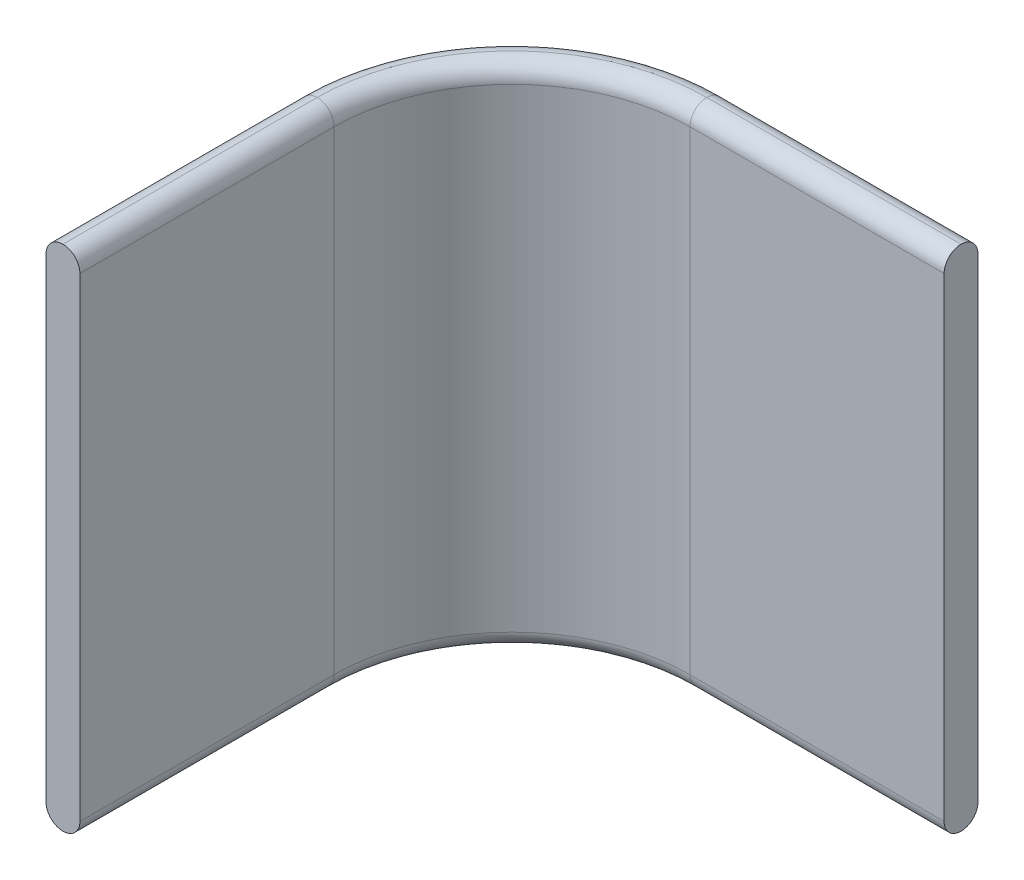
ISO-10303-21;
HEADER;
FILE_DESCRIPTION(('STEP AP214'),'2;1');
FILE_NAME('part.step','',(''),(''),'','','');
FILE_SCHEMA(('AUTOMOTIVE_DESIGN { 1 0 10303 214 1 1 1 1 }'));
ENDSEC;
DATA;
#1=APPLICATION_CONTEXT('core data for automotive mechanical design processes');
#2=APPLICATION_PROTOCOL_DEFINITION('international standard','automotive_design',2000,#1);
#3=PRODUCT_CONTEXT('',#1,'mechanical');
#4=PRODUCT('Part','Part','',(#3));
#5=PRODUCT_RELATED_PRODUCT_CATEGORY('part','',(#4));
#6=PRODUCT_DEFINITION_FORMATION('','',#4);
#7=PRODUCT_DEFINITION_CONTEXT('part definition',#1,'design');
#8=PRODUCT_DEFINITION('design','',#6,#7);
#9=PRODUCT_DEFINITION_SHAPE('','',#8);
#10=(LENGTH_UNIT() NAMED_UNIT(*) SI_UNIT(.MILLI.,.METRE.));
#11=(NAMED_UNIT(*) PLANE_ANGLE_UNIT() SI_UNIT($,.RADIAN.));
#12=(NAMED_UNIT(*) SI_UNIT($,.STERADIAN.) SOLID_ANGLE_UNIT());
#13=UNCERTAINTY_MEASURE_WITH_UNIT(LENGTH_MEASURE(1.E-05),#10,'distance_accuracy_value','');
#14=(GEOMETRIC_REPRESENTATION_CONTEXT(3) GLOBAL_UNCERTAINTY_ASSIGNED_CONTEXT((#13)) GLOBAL_UNIT_ASSIGNED_CONTEXT((#10,
#11,#12)) REPRESENTATION_CONTEXT('',''));
#15=CARTESIAN_POINT('',(0.,0.,0.));
#16=DIRECTION('',(0.,0.,1.));
#17=DIRECTION('',(1.,0.,0.));
#18=AXIS2_PLACEMENT_3D('',#15,#16,#17);
#19=CARTESIAN_POINT('',(0.,60.,0.));
#20=DIRECTION('',(0.,-1.,0.));
#21=DIRECTION('',(0.,0.,-1.));
#22=AXIS2_PLACEMENT_3D('',#19,#20,#21);
#23=CYLINDRICAL_SURFACE('',#22,25.);
#24=DIRECTION('',(0.,-1.,0.));
#25=VECTOR('',#24,1.);
#26=CARTESIAN_POINT('',(0.,60.,-25.));
#27=LINE('',#26,#25);
#28=CARTESIAN_POINT('',(0.,58.,-25.));
#29=VERTEX_POINT('',#28);
#30=CARTESIAN_POINT('',(0.,2.,-25.));
#31=VERTEX_POINT('',#30);
#32=EDGE_CURVE('E146',#29,#31,#27,.T.);
#33=ORIENTED_EDGE('',*,*,#32,.T.);
#34=CARTESIAN_POINT('',(0.,2.,0.));
#35=DIRECTION('',(0.,1.,0.));
#36=DIRECTION('',(0.,0.,1.));
#37=AXIS2_PLACEMENT_3D('',#34,#35,#36);
#38=CIRCLE('',#37,25.);
#39=CARTESIAN_POINT('',(-25.,2.,0.));
#40=VERTEX_POINT('',#39);
#41=EDGE_CURVE('E172',#31,#40,#38,.T.);
#42=ORIENTED_EDGE('',*,*,#41,.T.);
#43=DIRECTION('',(0.,-1.,0.));
#44=VECTOR('',#43,1.);
#45=CARTESIAN_POINT('',(-25.,60.,0.));
#46=LINE('',#45,#44);
#47=CARTESIAN_POINT('',(-25.,58.,0.));
#48=VERTEX_POINT('',#47);
#49=EDGE_CURVE('E232',#48,#40,#46,.T.);
#50=ORIENTED_EDGE('',*,*,#49,.F.);
#51=CARTESIAN_POINT('',(0.,58.,0.));
#52=DIRECTION('',(0.,1.,0.));
#53=DIRECTION('',(0.,0.,1.));
#54=AXIS2_PLACEMENT_3D('',#51,#52,#53);
#55=CIRCLE('',#54,25.);
#56=EDGE_CURVE('E113',#48,#29,#55,.F.);
#57=ORIENTED_EDGE('',*,*,#56,.T.);
#58=EDGE_LOOP('',(#33,#42,#50,#57));
#59=FACE_BOUND('',#58,.T.);
#60=ADVANCED_FACE('F39',(#59),#23,.T.);
#61=CARTESIAN_POINT('',(-25.,60.,15.));
#62=DIRECTION('',(1.,0.,0.));
#63=DIRECTION('',(0.,0.,-1.));
#64=AXIS2_PLACEMENT_3D('',#61,#62,#63);
#65=PLANE('',#64);
#66=ORIENTED_EDGE('',*,*,#49,.T.);
#67=DIRECTION('',(0.,0.,1.));
#68=VECTOR('',#67,1.);
#69=CARTESIAN_POINT('',(-25.,2.,15.));
#70=LINE('',#69,#68);
#71=CARTESIAN_POINT('',(-25.,2.,30.));
#72=VERTEX_POINT('',#71);
#73=EDGE_CURVE('E204',#40,#72,#70,.T.);
#74=ORIENTED_EDGE('',*,*,#73,.T.);
#75=DIRECTION('',(0.,-1.,0.));
#76=VECTOR('',#75,1.);
#77=CARTESIAN_POINT('',(-25.,60.,30.));
#78=LINE('',#77,#76);
#79=CARTESIAN_POINT('',(-25.,58.,30.));
#80=VERTEX_POINT('',#79);
#81=EDGE_CURVE('E236',#80,#72,#78,.T.);
#82=ORIENTED_EDGE('',*,*,#81,.F.);
#83=DIRECTION('',(0.,0.,1.));
#84=VECTOR('',#83,1.);
#85=CARTESIAN_POINT('',(-25.,58.,0.));
#86=LINE('',#85,#84);
#87=EDGE_CURVE('E208',#80,#48,#86,.F.);
#88=ORIENTED_EDGE('',*,*,#87,.T.);
#89=EDGE_LOOP('',(#66,#74,#82,#88));
#90=FACE_BOUND('',#89,.T.);
#91=ADVANCED_FACE('F333',(#90),#65,.F.);
#92=CARTESIAN_POINT('',(-25.,60.,30.));
#93=DIRECTION('',(0.,0.,-1.));
#94=DIRECTION('',(-1.,0.,0.));
#95=AXIS2_PLACEMENT_3D('',#92,#93,#94);
#96=PLANE('',#95);
#97=ORIENTED_EDGE('',*,*,#81,.T.);
#98=CARTESIAN_POINT('',(-23.,2.,30.));
#99=DIRECTION('',(0.,0.,-1.));
#100=DIRECTION('',(-1.,0.,0.));
#101=AXIS2_PLACEMENT_3D('',#98,#99,#100);
#102=CIRCLE('',#101,2.);
#103=CARTESIAN_POINT('',(-23.,0.,30.));
#104=VERTEX_POINT('',#103);
#105=EDGE_CURVE('E190',#72,#104,#102,.F.);
#106=ORIENTED_EDGE('',*,*,#105,.T.);
#107=CARTESIAN_POINT('',(-23.,2.,30.));
#108=DIRECTION('',(0.,0.,-1.));
#109=DIRECTION('',(-1.,0.,0.));
#110=AXIS2_PLACEMENT_3D('',#107,#108,#109);
#111=CIRCLE('',#110,2.);
#112=CARTESIAN_POINT('',(-21.,2.,30.));
#113=VERTEX_POINT('',#112);
#114=EDGE_CURVE('E194',#104,#113,#111,.F.);
#115=ORIENTED_EDGE('',*,*,#114,.T.);
#116=DIRECTION('',(0.,-1.,0.));
#117=VECTOR('',#116,1.);
#118=CARTESIAN_POINT('',(-21.,60.,30.));
#119=LINE('',#118,#117);
#120=CARTESIAN_POINT('',(-21.,58.,30.));
#121=VERTEX_POINT('',#120);
#122=EDGE_CURVE('E240',#121,#113,#119,.T.);
#123=ORIENTED_EDGE('',*,*,#122,.F.);
#124=CARTESIAN_POINT('',(-23.,58.,30.));
#125=DIRECTION('',(0.,0.,-1.));
#126=DIRECTION('',(-1.,0.,0.));
#127=AXIS2_PLACEMENT_3D('',#124,#125,#126);
#128=CIRCLE('',#127,2.);
#129=CARTESIAN_POINT('',(-23.,60.,30.));
#130=VERTEX_POINT('',#129);
#131=EDGE_CURVE('E200',#121,#130,#128,.F.);
#132=ORIENTED_EDGE('',*,*,#131,.T.);
#133=CARTESIAN_POINT('',(-23.,58.,30.));
#134=DIRECTION('',(0.,0.,-1.));
#135=DIRECTION('',(-1.,0.,0.));
#136=AXIS2_PLACEMENT_3D('',#133,#134,#135);
#137=CIRCLE('',#136,2.);
#138=EDGE_CURVE('E102',#130,#80,#137,.F.);
#139=ORIENTED_EDGE('',*,*,#138,.T.);
#140=EDGE_LOOP('',(#97,#106,#115,#123,#132,#139));
#141=FACE_BOUND('',#140,.T.);
#142=ADVANCED_FACE('F335',(#141),#96,.F.);
#143=CARTESIAN_POINT('',(-21.,60.,15.));
#144=DIRECTION('',(-1.,0.,0.));
#145=DIRECTION('',(0.,0.,1.));
#146=AXIS2_PLACEMENT_3D('',#143,#144,#145);
#147=PLANE('',#146);
#148=ORIENTED_EDGE('',*,*,#122,.T.);
#149=DIRECTION('',(0.,0.,-1.));
#150=VECTOR('',#149,1.);
#151=CARTESIAN_POINT('',(-21.,2.,15.));
#152=LINE('',#151,#150);
#153=CARTESIAN_POINT('',(-21.,2.,0.));
#154=VERTEX_POINT('',#153);
#155=EDGE_CURVE('E184',#113,#154,#152,.T.);
#156=ORIENTED_EDGE('',*,*,#155,.T.);
#157=DIRECTION('',(0.,-1.,0.));
#158=VECTOR('',#157,1.);
#159=CARTESIAN_POINT('',(-21.,60.,0.));
#160=LINE('',#159,#158);
#161=CARTESIAN_POINT('',(-21.,58.,0.));
#162=VERTEX_POINT('',#161);
#163=EDGE_CURVE('E244',#162,#154,#160,.T.);
#164=ORIENTED_EDGE('',*,*,#163,.F.);
#165=DIRECTION('',(0.,0.,-1.));
#166=VECTOR('',#165,1.);
#167=CARTESIAN_POINT('',(-21.,58.,30.));
#168=LINE('',#167,#166);
#169=EDGE_CURVE('E90',#162,#121,#168,.F.);
#170=ORIENTED_EDGE('',*,*,#169,.T.);
#171=EDGE_LOOP('',(#148,#156,#164,#170));
#172=FACE_BOUND('',#171,.T.);
#173=ADVANCED_FACE('F299',(#172),#147,.F.);
#174=CARTESIAN_POINT('',(0.,60.,0.));
#175=DIRECTION('',(0.,-1.,0.));
#176=DIRECTION('',(0.,0.,-1.));
#177=AXIS2_PLACEMENT_3D('',#174,#175,#176);
#178=CYLINDRICAL_SURFACE('',#177,21.);
#179=ORIENTED_EDGE('',*,*,#163,.T.);
#180=CARTESIAN_POINT('',(0.,2.,0.));
#181=DIRECTION('',(0.,1.,0.));
#182=DIRECTION('',(0.,0.,1.));
#183=AXIS2_PLACEMENT_3D('',#180,#181,#182);
#184=CIRCLE('',#183,21.);
#185=CARTESIAN_POINT('',(0.,2.,-21.));
#186=VERTEX_POINT('',#185);
#187=EDGE_CURVE('E11',#154,#186,#184,.F.);
#188=ORIENTED_EDGE('',*,*,#187,.T.);
#189=DIRECTION('',(0.,-1.,0.));
#190=VECTOR('',#189,1.);
#191=CARTESIAN_POINT('',(0.,60.,-21.));
#192=LINE('',#191,#190);
#193=CARTESIAN_POINT('',(0.,58.,-21.));
#194=VERTEX_POINT('',#193);
#195=EDGE_CURVE('E247',#194,#186,#192,.T.);
#196=ORIENTED_EDGE('',*,*,#195,.F.);
#197=CARTESIAN_POINT('',(0.,58.,0.));
#198=DIRECTION('',(0.,1.,0.));
#199=DIRECTION('',(0.,0.,1.));
#200=AXIS2_PLACEMENT_3D('',#197,#198,#199);
#201=CIRCLE('',#200,21.);
#202=EDGE_CURVE('E50',#194,#162,#201,.T.);
#203=ORIENTED_EDGE('',*,*,#202,.T.);
#204=EDGE_LOOP('',(#179,#188,#196,#203));
#205=FACE_BOUND('',#204,.T.);
#206=ADVANCED_FACE('F304',(#205),#178,.F.);
#207=CARTESIAN_POINT('',(15.,60.,-21.));
#208=DIRECTION('',(0.,0.,-1.));
#209=DIRECTION('',(-1.,0.,0.));
#210=AXIS2_PLACEMENT_3D('',#207,#208,#209);
#211=PLANE('',#210);
#212=ORIENTED_EDGE('',*,*,#195,.T.);
#213=DIRECTION('',(1.,0.,0.));
#214=VECTOR('',#213,1.);
#215=CARTESIAN_POINT('',(15.,2.,-21.));
#216=LINE('',#215,#214);
#217=CARTESIAN_POINT('',(30.,2.,-21.));
#218=VERTEX_POINT('',#217);
#219=EDGE_CURVE('E178',#186,#218,#216,.T.);
#220=ORIENTED_EDGE('',*,*,#219,.T.);
#221=DIRECTION('',(0.,-1.,0.));
#222=VECTOR('',#221,1.);
#223=CARTESIAN_POINT('',(30.,60.,-21.));
#224=LINE('',#223,#222);
#225=CARTESIAN_POINT('',(30.,58.,-21.));
#226=VERTEX_POINT('',#225);
#227=EDGE_CURVE('E250',#226,#218,#224,.T.);
#228=ORIENTED_EDGE('',*,*,#227,.F.);
#229=DIRECTION('',(1.,0.,0.));
#230=VECTOR('',#229,1.);
#231=CARTESIAN_POINT('',(0.,58.,-21.));
#232=LINE('',#231,#230);
#233=EDGE_CURVE('E129',#226,#194,#232,.F.);
#234=ORIENTED_EDGE('',*,*,#233,.T.);
#235=EDGE_LOOP('',(#212,#220,#228,#234));
#236=FACE_BOUND('',#235,.T.);
#237=ADVANCED_FACE('F318',(#236),#211,.F.);
#238=CARTESIAN_POINT('',(30.,60.,-21.));
#239=DIRECTION('',(-1.,0.,0.));
#240=DIRECTION('',(0.,0.,1.));
#241=AXIS2_PLACEMENT_3D('',#238,#239,#240);
#242=PLANE('',#241);
#243=CARTESIAN_POINT('',(30.,2.,-23.));
#244=DIRECTION('',(-1.,0.,0.));
#245=DIRECTION('',(0.,0.,1.));
#246=AXIS2_PLACEMENT_3D('',#243,#244,#245);
#247=CIRCLE('',#246,2.);
#248=CARTESIAN_POINT('',(30.,0.,-23.));
#249=VERTEX_POINT('',#248);
#250=EDGE_CURVE('E216',#218,#249,#247,.F.);
#251=ORIENTED_EDGE('',*,*,#250,.T.);
#252=CARTESIAN_POINT('',(30.,2.,-23.));
#253=DIRECTION('',(-1.,0.,0.));
#254=DIRECTION('',(0.,0.,1.));
#255=AXIS2_PLACEMENT_3D('',#252,#253,#254);
#256=CIRCLE('',#255,2.);
#257=CARTESIAN_POINT('',(30.,2.,-25.));
#258=VERTEX_POINT('',#257);
#259=EDGE_CURVE('E212',#249,#258,#256,.F.);
#260=ORIENTED_EDGE('',*,*,#259,.T.);
#261=DIRECTION('',(0.,-1.,0.));
#262=VECTOR('',#261,1.);
#263=CARTESIAN_POINT('',(30.,60.,-25.));
#264=LINE('',#263,#262);
#265=CARTESIAN_POINT('',(30.,58.,-25.));
#266=VERTEX_POINT('',#265);
#267=EDGE_CURVE('E254',#266,#258,#264,.T.);
#268=ORIENTED_EDGE('',*,*,#267,.F.);
#269=CARTESIAN_POINT('',(30.,58.,-23.));
#270=DIRECTION('',(-1.,0.,0.));
#271=DIRECTION('',(0.,0.,1.));
#272=AXIS2_PLACEMENT_3D('',#269,#270,#271);
#273=CIRCLE('',#272,2.);
#274=CARTESIAN_POINT('',(30.,60.,-23.));
#275=VERTEX_POINT('',#274);
#276=EDGE_CURVE('E220',#266,#275,#273,.F.);
#277=ORIENTED_EDGE('',*,*,#276,.T.);
#278=CARTESIAN_POINT('',(30.,58.,-23.));
#279=DIRECTION('',(-1.,0.,0.));
#280=DIRECTION('',(0.,0.,1.));
#281=AXIS2_PLACEMENT_3D('',#278,#279,#280);
#282=CIRCLE('',#281,2.);
#283=EDGE_CURVE('E133',#275,#226,#282,.F.);
#284=ORIENTED_EDGE('',*,*,#283,.T.);
#285=ORIENTED_EDGE('',*,*,#227,.T.);
#286=EDGE_LOOP('',(#251,#260,#268,#277,#284,#285));
#287=FACE_BOUND('',#286,.T.);
#288=ADVANCED_FACE('F320',(#287),#242,.F.);
#289=CARTESIAN_POINT('',(0.,60.,-25.));
#290=DIRECTION('',(0.,0.,1.));
#291=DIRECTION('',(1.,0.,0.));
#292=AXIS2_PLACEMENT_3D('',#289,#290,#291);
#293=PLANE('',#292);
#294=ORIENTED_EDGE('',*,*,#267,.T.);
#295=DIRECTION('',(-1.,0.,0.));
#296=VECTOR('',#295,1.);
#297=CARTESIAN_POINT('',(0.,2.,-25.));
#298=LINE('',#297,#296);
#299=EDGE_CURVE('E226',#258,#31,#298,.T.);
#300=ORIENTED_EDGE('',*,*,#299,.T.);
#301=ORIENTED_EDGE('',*,*,#32,.F.);
#302=DIRECTION('',(-1.,0.,0.));
#303=VECTOR('',#302,1.);
#304=CARTESIAN_POINT('',(30.,58.,-25.));
#305=LINE('',#304,#303);
#306=EDGE_CURVE('E139',#29,#266,#305,.F.);
#307=ORIENTED_EDGE('',*,*,#306,.T.);
#308=EDGE_LOOP('',(#294,#300,#301,#307));
#309=FACE_BOUND('',#308,.T.);
#310=ADVANCED_FACE('F269',(#309),#293,.F.);
#311=CARTESIAN_POINT('',(-23.,2.,15.));
#312=DIRECTION('',(0.,0.,-1.));
#313=DIRECTION('',(-1.,0.,0.));
#314=AXIS2_PLACEMENT_3D('',#311,#312,#313);
#315=CYLINDRICAL_SURFACE('',#314,2.);
#316=ORIENTED_EDGE('',*,*,#155,.F.);
#317=ORIENTED_EDGE('',*,*,#114,.F.);
#318=DIRECTION('',(0.,0.,-1.));
#319=VECTOR('',#318,1.);
#320=CARTESIAN_POINT('',(-23.,0.,0.));
#321=LINE('',#320,#319);
#322=CARTESIAN_POINT('',(-23.,0.,0.));
#323=VERTEX_POINT('',#322);
#324=EDGE_CURVE('E142',#323,#104,#321,.F.);
#325=ORIENTED_EDGE('',*,*,#324,.F.);
#326=CARTESIAN_POINT('',(-23.,2.,0.));
#327=DIRECTION('',(0.,0.,-1.));
#328=DIRECTION('',(-1.,0.,0.));
#329=AXIS2_PLACEMENT_3D('',#326,#327,#328);
#330=CIRCLE('',#329,2.);
#331=EDGE_CURVE('E147',#154,#323,#330,.T.);
#332=ORIENTED_EDGE('',*,*,#331,.F.);
#333=EDGE_LOOP('',(#316,#317,#325,#332));
#334=FACE_BOUND('',#333,.T.);
#335=ADVANCED_FACE('F305',(#334),#315,.T.);
#336=CARTESIAN_POINT('',(-23.,2.,15.));
#337=DIRECTION('',(0.,0.,1.));
#338=DIRECTION('',(1.,0.,0.));
#339=AXIS2_PLACEMENT_3D('',#336,#337,#338);
#340=CYLINDRICAL_SURFACE('',#339,2.);
#341=ORIENTED_EDGE('',*,*,#105,.F.);
#342=ORIENTED_EDGE('',*,*,#73,.F.);
#343=CARTESIAN_POINT('',(-23.,2.,0.));
#344=DIRECTION('',(0.,0.,-1.));
#345=DIRECTION('',(-1.,0.,0.));
#346=AXIS2_PLACEMENT_3D('',#343,#344,#345);
#347=CIRCLE('',#346,2.);
#348=EDGE_CURVE('E154',#323,#40,#347,.T.);
#349=ORIENTED_EDGE('',*,*,#348,.F.);
#350=ORIENTED_EDGE('',*,*,#324,.T.);
#351=EDGE_LOOP('',(#341,#342,#349,#350));
#352=FACE_BOUND('',#351,.T.);
#353=ADVANCED_FACE('F330',(#352),#340,.T.);
#354=CARTESIAN_POINT('',(0.,2.,0.));
#355=DIRECTION('',(0.,1.,0.));
#356=DIRECTION('',(0.,0.,1.));
#357=AXIS2_PLACEMENT_3D('',#354,#355,#356);
#358=TOROIDAL_SURFACE('',#357,23.,2.);
#359=CARTESIAN_POINT('',(0.,2.,-23.));
#360=DIRECTION('',(1.,0.,0.));
#361=DIRECTION('',(0.,1.,0.));
#362=AXIS2_PLACEMENT_3D('',#359,#360,#361);
#363=CIRCLE('',#362,2.);
#364=CARTESIAN_POINT('',(0.,0.,-23.));
#365=VERTEX_POINT('',#364);
#366=EDGE_CURVE('E151',#186,#365,#363,.T.);
#367=ORIENTED_EDGE('',*,*,#366,.F.);
#368=ORIENTED_EDGE('',*,*,#187,.F.);
#369=ORIENTED_EDGE('',*,*,#331,.T.);
#370=CARTESIAN_POINT('',(0.,0.,0.));
#371=DIRECTION('',(0.,1.,0.));
#372=DIRECTION('',(0.,0.,1.));
#373=AXIS2_PLACEMENT_3D('',#370,#371,#372);
#374=CIRCLE('',#373,23.);
#375=EDGE_CURVE('E158',#365,#323,#374,.T.);
#376=ORIENTED_EDGE('',*,*,#375,.F.);
#377=EDGE_LOOP('',(#367,#368,#369,#376));
#378=FACE_BOUND('',#377,.T.);
#379=ADVANCED_FACE('F310',(#378),#358,.T.);
#380=CARTESIAN_POINT('',(15.,2.,-23.));
#381=DIRECTION('',(1.,0.,0.));
#382=DIRECTION('',(0.,0.,-1.));
#383=AXIS2_PLACEMENT_3D('',#380,#381,#382);
#384=CYLINDRICAL_SURFACE('',#383,2.);
#385=ORIENTED_EDGE('',*,*,#219,.F.);
#386=ORIENTED_EDGE('',*,*,#366,.T.);
#387=DIRECTION('',(1.,0.,0.));
#388=VECTOR('',#387,1.);
#389=CARTESIAN_POINT('',(0.,0.,-23.));
#390=LINE('',#389,#388);
#391=EDGE_CURVE('E162',#249,#365,#390,.F.);
#392=ORIENTED_EDGE('',*,*,#391,.F.);
#393=ORIENTED_EDGE('',*,*,#250,.F.);
#394=EDGE_LOOP('',(#385,#386,#392,#393));
#395=FACE_BOUND('',#394,.T.);
#396=ADVANCED_FACE('F315',(#395),#384,.T.);
#397=CARTESIAN_POINT('',(0.,2.,0.));
#398=DIRECTION('',(0.,1.,0.));
#399=DIRECTION('',(0.,0.,1.));
#400=AXIS2_PLACEMENT_3D('',#397,#398,#399);
#401=TOROIDAL_SURFACE('',#400,23.,2.);
#402=ORIENTED_EDGE('',*,*,#348,.T.);
#403=ORIENTED_EDGE('',*,*,#41,.F.);
#404=CARTESIAN_POINT('',(0.,2.,-23.));
#405=DIRECTION('',(1.,0.,0.));
#406=DIRECTION('',(0.,0.,-1.));
#407=AXIS2_PLACEMENT_3D('',#404,#405,#406);
#408=CIRCLE('',#407,2.);
#409=EDGE_CURVE('E92',#365,#31,#408,.T.);
#410=ORIENTED_EDGE('',*,*,#409,.F.);
#411=ORIENTED_EDGE('',*,*,#375,.T.);
#412=EDGE_LOOP('',(#402,#403,#410,#411));
#413=FACE_BOUND('',#412,.T.);
#414=ADVANCED_FACE('F326',(#413),#401,.T.);
#415=CARTESIAN_POINT('',(0.,2.,-23.));
#416=DIRECTION('',(-1.,0.,0.));
#417=DIRECTION('',(0.,0.,1.));
#418=AXIS2_PLACEMENT_3D('',#415,#416,#417);
#419=CYLINDRICAL_SURFACE('',#418,2.);
#420=ORIENTED_EDGE('',*,*,#259,.F.);
#421=ORIENTED_EDGE('',*,*,#391,.T.);
#422=ORIENTED_EDGE('',*,*,#409,.T.);
#423=ORIENTED_EDGE('',*,*,#299,.F.);
#424=EDGE_LOOP('',(#420,#421,#422,#423));
#425=FACE_BOUND('',#424,.T.);
#426=ADVANCED_FACE('F323',(#425),#419,.T.);
#427=CARTESIAN_POINT('',(-23.,58.,0.));
#428=DIRECTION('',(0.,0.,1.));
#429=DIRECTION('',(1.,0.,0.));
#430=AXIS2_PLACEMENT_3D('',#427,#428,#429);
#431=CYLINDRICAL_SURFACE('',#430,2.);
#432=ORIENTED_EDGE('',*,*,#131,.F.);
#433=ORIENTED_EDGE('',*,*,#169,.F.);
#434=CARTESIAN_POINT('',(-23.,58.,0.));
#435=DIRECTION('',(0.,0.,-1.));
#436=DIRECTION('',(-1.,0.,0.));
#437=AXIS2_PLACEMENT_3D('',#434,#435,#436);
#438=CIRCLE('',#437,2.);
#439=CARTESIAN_POINT('',(-23.,60.,0.));
#440=VERTEX_POINT('',#439);
#441=EDGE_CURVE('E43',#440,#162,#438,.T.);
#442=ORIENTED_EDGE('',*,*,#441,.F.);
#443=DIRECTION('',(0.,0.,-1.));
#444=VECTOR('',#443,1.);
#445=CARTESIAN_POINT('',(-23.,60.,0.));
#446=LINE('',#445,#444);
#447=EDGE_CURVE('E86',#130,#440,#446,.T.);
#448=ORIENTED_EDGE('',*,*,#447,.F.);
#449=EDGE_LOOP('',(#432,#433,#442,#448));
#450=FACE_BOUND('',#449,.T.);
#451=ADVANCED_FACE('F41',(#450),#431,.T.);
#452=CARTESIAN_POINT('',(0.,58.,0.));
#453=DIRECTION('',(0.,1.,0.));
#454=DIRECTION('',(0.,0.,1.));
#455=AXIS2_PLACEMENT_3D('',#452,#453,#454);
#456=TOROIDAL_SURFACE('',#455,23.,2.);
#457=ORIENTED_EDGE('',*,*,#441,.T.);
#458=ORIENTED_EDGE('',*,*,#202,.F.);
#459=CARTESIAN_POINT('',(0.,58.,-23.));
#460=DIRECTION('',(1.,0.,0.));
#461=DIRECTION('',(0.,0.,-1.));
#462=AXIS2_PLACEMENT_3D('',#459,#460,#461);
#463=CIRCLE('',#462,2.);
#464=CARTESIAN_POINT('',(0.,60.,-23.));
#465=VERTEX_POINT('',#464);
#466=EDGE_CURVE('E76',#465,#194,#463,.T.);
#467=ORIENTED_EDGE('',*,*,#466,.F.);
#468=CARTESIAN_POINT('',(0.,60.,0.));
#469=DIRECTION('',(0.,1.,0.));
#470=DIRECTION('',(0.,0.,1.));
#471=AXIS2_PLACEMENT_3D('',#468,#469,#470);
#472=CIRCLE('',#471,23.);
#473=EDGE_CURVE('E104',#440,#465,#472,.F.);
#474=ORIENTED_EDGE('',*,*,#473,.F.);
#475=EDGE_LOOP('',(#457,#458,#467,#474));
#476=FACE_BOUND('',#475,.T.);
#477=ADVANCED_FACE('F105',(#476),#456,.T.);
#478=CARTESIAN_POINT('',(-23.,58.,0.));
#479=DIRECTION('',(0.,0.,-1.));
#480=DIRECTION('',(-1.,0.,0.));
#481=AXIS2_PLACEMENT_3D('',#478,#479,#480);
#482=CYLINDRICAL_SURFACE('',#481,2.);
#483=ORIENTED_EDGE('',*,*,#138,.F.);
#484=ORIENTED_EDGE('',*,*,#447,.T.);
#485=CARTESIAN_POINT('',(-23.,58.,0.));
#486=DIRECTION('',(0.,0.,-1.));
#487=DIRECTION('',(-1.,0.,0.));
#488=AXIS2_PLACEMENT_3D('',#485,#486,#487);
#489=CIRCLE('',#488,2.);
#490=EDGE_CURVE('E99',#48,#440,#489,.T.);
#491=ORIENTED_EDGE('',*,*,#490,.F.);
#492=ORIENTED_EDGE('',*,*,#87,.F.);
#493=EDGE_LOOP('',(#483,#484,#491,#492));
#494=FACE_BOUND('',#493,.T.);
#495=ADVANCED_FACE('F95',(#494),#482,.T.);
#496=CARTESIAN_POINT('',(0.,58.,-23.));
#497=DIRECTION('',(-1.,0.,0.));
#498=DIRECTION('',(0.,0.,1.));
#499=AXIS2_PLACEMENT_3D('',#496,#497,#498);
#500=CYLINDRICAL_SURFACE('',#499,2.);
#501=ORIENTED_EDGE('',*,*,#233,.F.);
#502=ORIENTED_EDGE('',*,*,#283,.F.);
#503=DIRECTION('',(1.,0.,0.));
#504=VECTOR('',#503,1.);
#505=CARTESIAN_POINT('',(30.,60.,-23.));
#506=LINE('',#505,#504);
#507=EDGE_CURVE('E115',#465,#275,#506,.T.);
#508=ORIENTED_EDGE('',*,*,#507,.F.);
#509=ORIENTED_EDGE('',*,*,#466,.T.);
#510=EDGE_LOOP('',(#501,#502,#508,#509));
#511=FACE_BOUND('',#510,.T.);
#512=ADVANCED_FACE('F126',(#511),#500,.T.);
#513=CARTESIAN_POINT('',(0.,58.,0.));
#514=DIRECTION('',(0.,1.,0.));
#515=DIRECTION('',(0.,0.,1.));
#516=AXIS2_PLACEMENT_3D('',#513,#514,#515);
#517=TOROIDAL_SURFACE('',#516,23.,2.);
#518=ORIENTED_EDGE('',*,*,#490,.T.);
#519=ORIENTED_EDGE('',*,*,#473,.T.);
#520=CARTESIAN_POINT('',(0.,58.,-23.));
#521=DIRECTION('',(1.,0.,0.));
#522=DIRECTION('',(0.,1.,0.));
#523=AXIS2_PLACEMENT_3D('',#520,#521,#522);
#524=CIRCLE('',#523,2.);
#525=EDGE_CURVE('E119',#29,#465,#524,.T.);
#526=ORIENTED_EDGE('',*,*,#525,.F.);
#527=ORIENTED_EDGE('',*,*,#56,.F.);
#528=EDGE_LOOP('',(#518,#519,#526,#527));
#529=FACE_BOUND('',#528,.T.);
#530=ADVANCED_FACE('F111',(#529),#517,.T.);
#531=CARTESIAN_POINT('',(0.,58.,-23.));
#532=DIRECTION('',(1.,0.,0.));
#533=DIRECTION('',(0.,0.,-1.));
#534=AXIS2_PLACEMENT_3D('',#531,#532,#533);
#535=CYLINDRICAL_SURFACE('',#534,2.);
#536=ORIENTED_EDGE('',*,*,#276,.F.);
#537=ORIENTED_EDGE('',*,*,#306,.F.);
#538=ORIENTED_EDGE('',*,*,#525,.T.);
#539=ORIENTED_EDGE('',*,*,#507,.T.);
#540=EDGE_LOOP('',(#536,#537,#538,#539));
#541=FACE_BOUND('',#540,.T.);
#542=ADVANCED_FACE('F137',(#541),#535,.T.);
#543=CLOSED_SHELL('',(#60,#91,#142,#173,#206,#237,#288,#310,#335,#353,#379,#396,#414,#426,#451,
#477,#495,#512,#530,#542));
#544=MANIFOLD_SOLID_BREP('B2',#543);
#545=ADVANCED_BREP_SHAPE_REPRESENTATION('',(#18,#544),#14);
#546=SHAPE_DEFINITION_REPRESENTATION(#9,#545);
ENDSEC;
END-ISO-10303-21;
